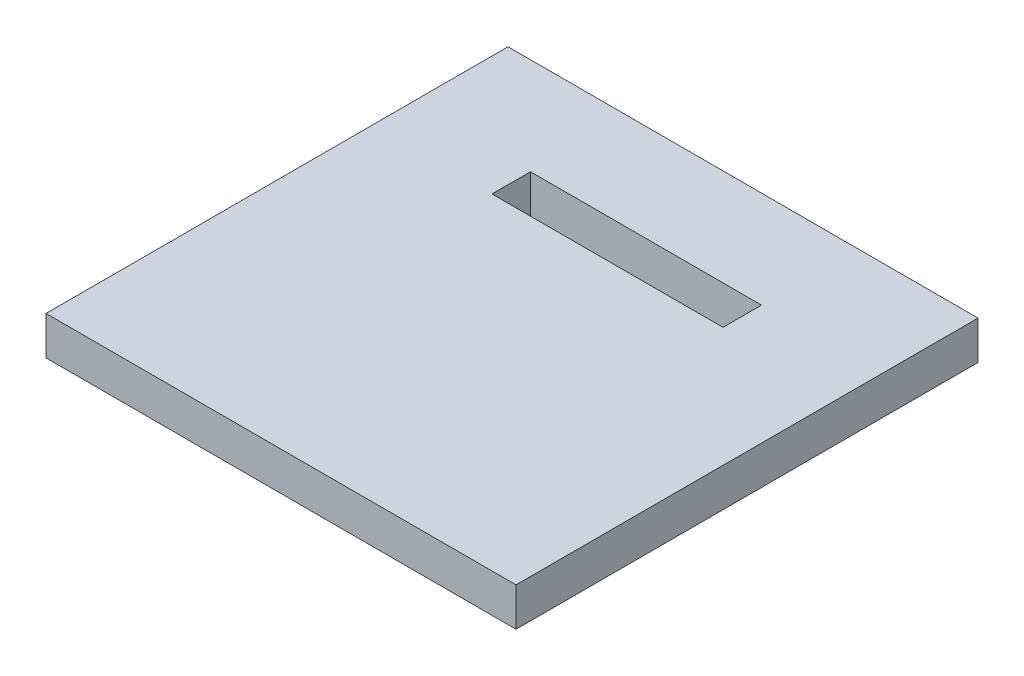
ISO-10303-21;
HEADER;
FILE_DESCRIPTION(('STEP AP214'),'2;1');
FILE_NAME('part.step','',(''),(''),'','','');
FILE_SCHEMA(('AUTOMOTIVE_DESIGN { 1 0 10303 214 1 1 1 1 }'));
ENDSEC;
DATA;
#1=APPLICATION_CONTEXT('core data for automotive mechanical design processes');
#2=APPLICATION_PROTOCOL_DEFINITION('international standard','automotive_design',2000,#1);
#3=PRODUCT_CONTEXT('',#1,'mechanical');
#4=PRODUCT('Part','Part','',(#3));
#5=PRODUCT_RELATED_PRODUCT_CATEGORY('part','',(#4));
#6=PRODUCT_DEFINITION_FORMATION('','',#4);
#7=PRODUCT_DEFINITION_CONTEXT('part definition',#1,'design');
#8=PRODUCT_DEFINITION('design','',#6,#7);
#9=PRODUCT_DEFINITION_SHAPE('','',#8);
#10=(LENGTH_UNIT() NAMED_UNIT(*) SI_UNIT(.MILLI.,.METRE.));
#11=(NAMED_UNIT(*) PLANE_ANGLE_UNIT() SI_UNIT($,.RADIAN.));
#12=(NAMED_UNIT(*) SI_UNIT($,.STERADIAN.) SOLID_ANGLE_UNIT());
#13=UNCERTAINTY_MEASURE_WITH_UNIT(LENGTH_MEASURE(1.E-05),#10,'distance_accuracy_value','');
#14=(GEOMETRIC_REPRESENTATION_CONTEXT(3) GLOBAL_UNCERTAINTY_ASSIGNED_CONTEXT((#13)) GLOBAL_UNIT_ASSIGNED_CONTEXT((#10,
#11,#12)) REPRESENTATION_CONTEXT('',''));
#15=CARTESIAN_POINT('',(0.,0.,0.));
#16=DIRECTION('',(0.,0.,1.));
#17=DIRECTION('',(1.,0.,0.));
#18=AXIS2_PLACEMENT_3D('',#15,#16,#17);
#19=CARTESIAN_POINT('',(0.,3.175,0.));
#20=DIRECTION('',(0.,-1.,0.));
#21=DIRECTION('',(0.,0.,-1.));
#22=AXIS2_PLACEMENT_3D('',#19,#20,#21);
#23=PLANE('',#22);
#24=DIRECTION('',(0.,0.,1.));
#25=VECTOR('',#24,1.);
#26=CARTESIAN_POINT('',(0.,3.175,0.));
#27=LINE('',#26,#25);
#28=CARTESIAN_POINT('',(0.,3.175,-38.1));
#29=VERTEX_POINT('',#28);
#30=CARTESIAN_POINT('',(0.,3.175,0.));
#31=VERTEX_POINT('',#30);
#32=EDGE_CURVE('E134',#29,#31,#27,.T.);
#33=ORIENTED_EDGE('',*,*,#32,.T.);
#34=DIRECTION('',(1.,0.,0.));
#35=VECTOR('',#34,1.);
#36=CARTESIAN_POINT('',(0.,3.175,0.));
#37=LINE('',#36,#35);
#38=CARTESIAN_POINT('',(38.7604,3.175,0.));
#39=VERTEX_POINT('',#38);
#40=EDGE_CURVE('E137',#31,#39,#37,.T.);
#41=ORIENTED_EDGE('',*,*,#40,.T.);
#42=DIRECTION('',(0.,0.,-1.));
#43=VECTOR('',#42,1.);
#44=CARTESIAN_POINT('',(38.7604,3.175,0.));
#45=LINE('',#44,#43);
#46=CARTESIAN_POINT('',(38.7604,3.175,-38.1));
#47=VERTEX_POINT('',#46);
#48=EDGE_CURVE('E140',#39,#47,#45,.T.);
#49=ORIENTED_EDGE('',*,*,#48,.T.);
#50=DIRECTION('',(-1.,0.,0.));
#51=VECTOR('',#50,1.);
#52=CARTESIAN_POINT('',(0.,3.175,-38.1));
#53=LINE('',#52,#51);
#54=EDGE_CURVE('E142',#47,#29,#53,.T.);
#55=ORIENTED_EDGE('',*,*,#54,.T.);
#56=EDGE_LOOP('',(#33,#41,#49,#55));
#57=FACE_BOUND('',#56,.T.);
#58=DIRECTION('',(0.,0.,1.));
#59=VECTOR('',#58,1.);
#60=CARTESIAN_POINT('',(9.8552,3.175,-30.099));
#61=LINE('',#60,#59);
#62=CARTESIAN_POINT('',(9.8552,3.175,-30.099));
#63=VERTEX_POINT('',#62);
#64=CARTESIAN_POINT('',(9.8552,3.175,-26.924));
#65=VERTEX_POINT('',#64);
#66=EDGE_CURVE('E98',#63,#65,#61,.T.);
#67=ORIENTED_EDGE('',*,*,#66,.F.);
#68=DIRECTION('',(-1.,0.,0.));
#69=VECTOR('',#68,1.);
#70=CARTESIAN_POINT('',(9.8552,3.175,-30.099));
#71=LINE('',#70,#69);
#72=CARTESIAN_POINT('',(28.9052,3.175,-30.099));
#73=VERTEX_POINT('',#72);
#74=EDGE_CURVE('E120',#73,#63,#71,.T.);
#75=ORIENTED_EDGE('',*,*,#74,.F.);
#76=DIRECTION('',(0.,0.,-1.));
#77=VECTOR('',#76,1.);
#78=CARTESIAN_POINT('',(28.9052,3.175,-30.099));
#79=LINE('',#78,#77);
#80=CARTESIAN_POINT('',(28.9052,3.175,-26.924));
#81=VERTEX_POINT('',#80);
#82=EDGE_CURVE('E118',#81,#73,#79,.T.);
#83=ORIENTED_EDGE('',*,*,#82,.F.);
#84=DIRECTION('',(1.,0.,0.));
#85=VECTOR('',#84,1.);
#86=CARTESIAN_POINT('',(9.8552,3.175,-26.924));
#87=LINE('',#86,#85);
#88=EDGE_CURVE('E106',#65,#81,#87,.T.);
#89=ORIENTED_EDGE('',*,*,#88,.F.);
#90=EDGE_LOOP('',(#67,#75,#83,#89));
#91=FACE_BOUND('',#90,.T.);
#92=ADVANCED_FACE('F33',(#57,#91),#23,.F.);
#93=CARTESIAN_POINT('',(0.,0.,0.));
#94=DIRECTION('',(0.,-1.,0.));
#95=DIRECTION('',(0.,0.,-1.));
#96=AXIS2_PLACEMENT_3D('',#93,#94,#95);
#97=PLANE('',#96);
#98=DIRECTION('',(0.,0.,1.));
#99=VECTOR('',#98,1.);
#100=CARTESIAN_POINT('',(0.,0.,0.));
#101=LINE('',#100,#99);
#102=CARTESIAN_POINT('',(0.,0.,-38.1));
#103=VERTEX_POINT('',#102);
#104=CARTESIAN_POINT('',(0.,0.,0.));
#105=VERTEX_POINT('',#104);
#106=EDGE_CURVE('E114',#103,#105,#101,.T.);
#107=ORIENTED_EDGE('',*,*,#106,.F.);
#108=DIRECTION('',(-1.,0.,0.));
#109=VECTOR('',#108,1.);
#110=CARTESIAN_POINT('',(0.,0.,-38.1));
#111=LINE('',#110,#109);
#112=CARTESIAN_POINT('',(38.7604,0.,-38.1));
#113=VERTEX_POINT('',#112);
#114=EDGE_CURVE('E138',#113,#103,#111,.T.);
#115=ORIENTED_EDGE('',*,*,#114,.F.);
#116=DIRECTION('',(0.,0.,-1.));
#117=VECTOR('',#116,1.);
#118=CARTESIAN_POINT('',(38.7604,0.,0.));
#119=LINE('',#118,#117);
#120=CARTESIAN_POINT('',(38.7604,0.,0.));
#121=VERTEX_POINT('',#120);
#122=EDGE_CURVE('E149',#121,#113,#119,.T.);
#123=ORIENTED_EDGE('',*,*,#122,.F.);
#124=DIRECTION('',(1.,0.,0.));
#125=VECTOR('',#124,1.);
#126=CARTESIAN_POINT('',(0.,0.,0.));
#127=LINE('',#126,#125);
#128=EDGE_CURVE('E147',#105,#121,#127,.T.);
#129=ORIENTED_EDGE('',*,*,#128,.F.);
#130=EDGE_LOOP('',(#107,#115,#123,#129));
#131=FACE_BOUND('',#130,.T.);
#132=DIRECTION('',(-1.,0.,0.));
#133=VECTOR('',#132,1.);
#134=CARTESIAN_POINT('',(9.8552,0.,-30.099));
#135=LINE('',#134,#133);
#136=CARTESIAN_POINT('',(28.9052,0.,-30.099));
#137=VERTEX_POINT('',#136);
#138=CARTESIAN_POINT('',(9.8552,0.,-30.099));
#139=VERTEX_POINT('',#138);
#140=EDGE_CURVE('E107',#137,#139,#135,.T.);
#141=ORIENTED_EDGE('',*,*,#140,.T.);
#142=DIRECTION('',(0.,0.,1.));
#143=VECTOR('',#142,1.);
#144=CARTESIAN_POINT('',(9.8552,0.,-30.099));
#145=LINE('',#144,#143);
#146=CARTESIAN_POINT('',(9.8552,0.,-26.924));
#147=VERTEX_POINT('',#146);
#148=EDGE_CURVE('E56',#139,#147,#145,.T.);
#149=ORIENTED_EDGE('',*,*,#148,.T.);
#150=DIRECTION('',(1.,0.,0.));
#151=VECTOR('',#150,1.);
#152=CARTESIAN_POINT('',(9.8552,0.,-26.924));
#153=LINE('',#152,#151);
#154=CARTESIAN_POINT('',(28.9052,0.,-26.924));
#155=VERTEX_POINT('',#154);
#156=EDGE_CURVE('E113',#147,#155,#153,.T.);
#157=ORIENTED_EDGE('',*,*,#156,.T.);
#158=DIRECTION('',(0.,0.,-1.));
#159=VECTOR('',#158,1.);
#160=CARTESIAN_POINT('',(28.9052,0.,-30.099));
#161=LINE('',#160,#159);
#162=EDGE_CURVE('E126',#155,#137,#161,.T.);
#163=ORIENTED_EDGE('',*,*,#162,.T.);
#164=EDGE_LOOP('',(#141,#149,#157,#163));
#165=FACE_BOUND('',#164,.T.);
#166=ADVANCED_FACE('F167',(#131,#165),#97,.T.);
#167=CARTESIAN_POINT('',(0.,3.175,0.));
#168=DIRECTION('',(1.,0.,0.));
#169=DIRECTION('',(0.,0.,-1.));
#170=AXIS2_PLACEMENT_3D('',#167,#168,#169);
#171=PLANE('',#170);
#172=ORIENTED_EDGE('',*,*,#106,.T.);
#173=DIRECTION('',(0.,-1.,0.));
#174=VECTOR('',#173,1.);
#175=CARTESIAN_POINT('',(0.,3.175,0.));
#176=LINE('',#175,#174);
#177=EDGE_CURVE('E11',#31,#105,#176,.T.);
#178=ORIENTED_EDGE('',*,*,#177,.F.);
#179=ORIENTED_EDGE('',*,*,#32,.F.);
#180=DIRECTION('',(0.,-1.,0.));
#181=VECTOR('',#180,1.);
#182=CARTESIAN_POINT('',(0.,3.175,-38.1));
#183=LINE('',#182,#181);
#184=EDGE_CURVE('E144',#29,#103,#183,.T.);
#185=ORIENTED_EDGE('',*,*,#184,.T.);
#186=EDGE_LOOP('',(#172,#178,#179,#185));
#187=FACE_BOUND('',#186,.T.);
#188=ADVANCED_FACE('F35',(#187),#171,.F.);
#189=CARTESIAN_POINT('',(0.,3.175,0.));
#190=DIRECTION('',(0.,0.,-1.));
#191=DIRECTION('',(-1.,0.,0.));
#192=AXIS2_PLACEMENT_3D('',#189,#190,#191);
#193=PLANE('',#192);
#194=ORIENTED_EDGE('',*,*,#128,.T.);
#195=DIRECTION('',(0.,-1.,0.));
#196=VECTOR('',#195,1.);
#197=CARTESIAN_POINT('',(38.7604,3.175,0.));
#198=LINE('',#197,#196);
#199=EDGE_CURVE('E41',#39,#121,#198,.T.);
#200=ORIENTED_EDGE('',*,*,#199,.F.);
#201=ORIENTED_EDGE('',*,*,#40,.F.);
#202=ORIENTED_EDGE('',*,*,#177,.T.);
#203=EDGE_LOOP('',(#194,#200,#201,#202));
#204=FACE_BOUND('',#203,.T.);
#205=ADVANCED_FACE('F177',(#204),#193,.F.);
#206=CARTESIAN_POINT('',(38.7604,3.175,0.));
#207=DIRECTION('',(-1.,0.,0.));
#208=DIRECTION('',(0.,0.,1.));
#209=AXIS2_PLACEMENT_3D('',#206,#207,#208);
#210=PLANE('',#209);
#211=ORIENTED_EDGE('',*,*,#122,.T.);
#212=DIRECTION('',(0.,-1.,0.));
#213=VECTOR('',#212,1.);
#214=CARTESIAN_POINT('',(38.7604,3.175,-38.1));
#215=LINE('',#214,#213);
#216=EDGE_CURVE('E154',#47,#113,#215,.T.);
#217=ORIENTED_EDGE('',*,*,#216,.F.);
#218=ORIENTED_EDGE('',*,*,#48,.F.);
#219=ORIENTED_EDGE('',*,*,#199,.T.);
#220=EDGE_LOOP('',(#211,#217,#218,#219));
#221=FACE_BOUND('',#220,.T.);
#222=ADVANCED_FACE('F161',(#221),#210,.F.);
#223=CARTESIAN_POINT('',(0.,3.175,-38.1));
#224=DIRECTION('',(0.,0.,1.));
#225=DIRECTION('',(1.,0.,0.));
#226=AXIS2_PLACEMENT_3D('',#223,#224,#225);
#227=PLANE('',#226);
#228=ORIENTED_EDGE('',*,*,#114,.T.);
#229=ORIENTED_EDGE('',*,*,#184,.F.);
#230=ORIENTED_EDGE('',*,*,#54,.F.);
#231=ORIENTED_EDGE('',*,*,#216,.T.);
#232=EDGE_LOOP('',(#228,#229,#230,#231));
#233=FACE_BOUND('',#232,.T.);
#234=ADVANCED_FACE('F171',(#233),#227,.F.);
#235=CARTESIAN_POINT('',(9.8552,3.175,-30.099));
#236=DIRECTION('',(1.,0.,0.));
#237=DIRECTION('',(0.,0.,-1.));
#238=AXIS2_PLACEMENT_3D('',#235,#236,#237);
#239=PLANE('',#238);
#240=ORIENTED_EDGE('',*,*,#148,.F.);
#241=DIRECTION('',(0.,-1.,0.));
#242=VECTOR('',#241,1.);
#243=CARTESIAN_POINT('',(9.8552,3.175,-30.099));
#244=LINE('',#243,#242);
#245=EDGE_CURVE('E102',#63,#139,#244,.T.);
#246=ORIENTED_EDGE('',*,*,#245,.F.);
#247=ORIENTED_EDGE('',*,*,#66,.T.);
#248=DIRECTION('',(0.,-1.,0.));
#249=VECTOR('',#248,1.);
#250=CARTESIAN_POINT('',(9.8552,3.175,-26.924));
#251=LINE('',#250,#249);
#252=EDGE_CURVE('E101',#65,#147,#251,.T.);
#253=ORIENTED_EDGE('',*,*,#252,.T.);
#254=EDGE_LOOP('',(#240,#246,#247,#253));
#255=FACE_BOUND('',#254,.T.);
#256=ADVANCED_FACE('F100',(#255),#239,.T.);
#257=CARTESIAN_POINT('',(9.8552,3.175,-26.924));
#258=DIRECTION('',(0.,0.,-1.));
#259=DIRECTION('',(-1.,0.,0.));
#260=AXIS2_PLACEMENT_3D('',#257,#258,#259);
#261=PLANE('',#260);
#262=ORIENTED_EDGE('',*,*,#156,.F.);
#263=ORIENTED_EDGE('',*,*,#252,.F.);
#264=ORIENTED_EDGE('',*,*,#88,.T.);
#265=DIRECTION('',(0.,-1.,0.));
#266=VECTOR('',#265,1.);
#267=CARTESIAN_POINT('',(28.9052,3.175,-26.924));
#268=LINE('',#267,#266);
#269=EDGE_CURVE('E115',#81,#155,#268,.T.);
#270=ORIENTED_EDGE('',*,*,#269,.T.);
#271=EDGE_LOOP('',(#262,#263,#264,#270));
#272=FACE_BOUND('',#271,.T.);
#273=ADVANCED_FACE('F110',(#272),#261,.T.);
#274=CARTESIAN_POINT('',(28.9052,3.175,-30.099));
#275=DIRECTION('',(-1.,0.,0.));
#276=DIRECTION('',(0.,0.,1.));
#277=AXIS2_PLACEMENT_3D('',#274,#275,#276);
#278=PLANE('',#277);
#279=ORIENTED_EDGE('',*,*,#162,.F.);
#280=ORIENTED_EDGE('',*,*,#269,.F.);
#281=ORIENTED_EDGE('',*,*,#82,.T.);
#282=DIRECTION('',(0.,-1.,0.));
#283=VECTOR('',#282,1.);
#284=CARTESIAN_POINT('',(28.9052,3.175,-30.099));
#285=LINE('',#284,#283);
#286=EDGE_CURVE('E48',#73,#137,#285,.T.);
#287=ORIENTED_EDGE('',*,*,#286,.T.);
#288=EDGE_LOOP('',(#279,#280,#281,#287));
#289=FACE_BOUND('',#288,.T.);
#290=ADVANCED_FACE('F200',(#289),#278,.T.);
#291=CARTESIAN_POINT('',(9.8552,3.175,-30.099));
#292=DIRECTION('',(0.,0.,1.));
#293=DIRECTION('',(1.,0.,0.));
#294=AXIS2_PLACEMENT_3D('',#291,#292,#293);
#295=PLANE('',#294);
#296=ORIENTED_EDGE('',*,*,#140,.F.);
#297=ORIENTED_EDGE('',*,*,#286,.F.);
#298=ORIENTED_EDGE('',*,*,#74,.T.);
#299=ORIENTED_EDGE('',*,*,#245,.T.);
#300=EDGE_LOOP('',(#296,#297,#298,#299));
#301=FACE_BOUND('',#300,.T.);
#302=ADVANCED_FACE('F204',(#301),#295,.T.);
#303=CLOSED_SHELL('',(#92,#166,#188,#205,#222,#234,#256,#273,#290,#302));
#304=MANIFOLD_SOLID_BREP('B2',#303);
#305=ADVANCED_BREP_SHAPE_REPRESENTATION('',(#18,#304),#14);
#306=SHAPE_DEFINITION_REPRESENTATION(#9,#305);
ENDSEC;
END-ISO-10303-21;
